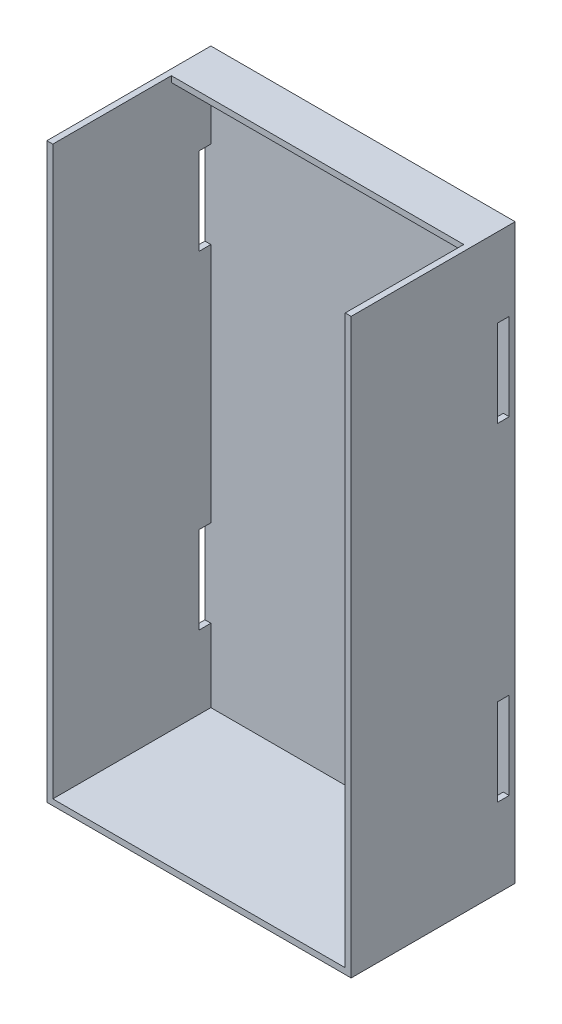
ISO-10303-21;
HEADER;
FILE_DESCRIPTION(('STEP AP214'),'2;1');
FILE_NAME('part.step','',(''),(''),'','','');
FILE_SCHEMA(('AUTOMOTIVE_DESIGN { 1 0 10303 214 1 1 1 1 }'));
ENDSEC;
DATA;
#1=APPLICATION_CONTEXT('core data for automotive mechanical design processes');
#2=APPLICATION_PROTOCOL_DEFINITION('international standard','automotive_design',2000,#1);
#3=PRODUCT_CONTEXT('',#1,'mechanical');
#4=PRODUCT('Part','Part','',(#3));
#5=PRODUCT_RELATED_PRODUCT_CATEGORY('part','',(#4));
#6=PRODUCT_DEFINITION_FORMATION('','',#4);
#7=PRODUCT_DEFINITION_CONTEXT('part definition',#1,'design');
#8=PRODUCT_DEFINITION('design','',#6,#7);
#9=PRODUCT_DEFINITION_SHAPE('','',#8);
#10=(LENGTH_UNIT() NAMED_UNIT(*) SI_UNIT(.MILLI.,.METRE.));
#11=(NAMED_UNIT(*) PLANE_ANGLE_UNIT() SI_UNIT($,.RADIAN.));
#12=(NAMED_UNIT(*) SI_UNIT($,.STERADIAN.) SOLID_ANGLE_UNIT());
#13=UNCERTAINTY_MEASURE_WITH_UNIT(LENGTH_MEASURE(1.E-05),#10,'distance_accuracy_value','');
#14=(GEOMETRIC_REPRESENTATION_CONTEXT(3) GLOBAL_UNCERTAINTY_ASSIGNED_CONTEXT((#13)) GLOBAL_UNIT_ASSIGNED_CONTEXT((#10,
#11,#12)) REPRESENTATION_CONTEXT('',''));
#15=CARTESIAN_POINT('',(0.,0.,0.));
#16=DIRECTION('',(0.,0.,1.));
#17=DIRECTION('',(1.,0.,0.));
#18=AXIS2_PLACEMENT_3D('',#15,#16,#17);
#19=CARTESIAN_POINT('',(0.,0.,1.5));
#20=DIRECTION('',(0.,0.,-1.));
#21=DIRECTION('',(-1.,0.,0.));
#22=AXIS2_PLACEMENT_3D('',#19,#20,#21);
#23=PLANE('',#22);
#24=DIRECTION('',(0.,-1.,0.));
#25=VECTOR('',#24,1.);
#26=CARTESIAN_POINT('',(75.5,1.5,1.5));
#27=LINE('',#26,#25);
#28=CARTESIAN_POINT('',(75.5,20.,1.5));
#29=VERTEX_POINT('',#28);
#30=CARTESIAN_POINT('',(75.5,1.5,1.5));
#31=VERTEX_POINT('',#30);
#32=EDGE_CURVE('E391',#29,#31,#27,.T.);
#33=ORIENTED_EDGE('',*,*,#32,.F.);
#34=DIRECTION('',(1.,0.,0.));
#35=VECTOR('',#34,1.);
#36=CARTESIAN_POINT('',(-23.,20.,1.49999999999999));
#37=LINE('',#36,#35);
#38=CARTESIAN_POINT('',(77.,20.,1.49999999999999));
#39=VERTEX_POINT('',#38);
#40=EDGE_CURVE('E55',#29,#39,#37,.T.);
#41=ORIENTED_EDGE('',*,*,#40,.T.);
#42=DIRECTION('',(0.,1.,0.));
#43=VECTOR('',#42,1.);
#44=CARTESIAN_POINT('',(77.,42.,1.49999999999999));
#45=LINE('',#44,#43);
#46=CARTESIAN_POINT('',(77.,42.,1.49999999999999));
#47=VERTEX_POINT('',#46);
#48=EDGE_CURVE('E262',#39,#47,#45,.T.);
#49=ORIENTED_EDGE('',*,*,#48,.T.);
#50=DIRECTION('',(1.,0.,0.));
#51=VECTOR('',#50,1.);
#52=CARTESIAN_POINT('',(-23.,41.9999999999999,1.49999999999999));
#53=LINE('',#52,#51);
#54=CARTESIAN_POINT('',(75.5,42.,1.49999999999999));
#55=VERTEX_POINT('',#54);
#56=EDGE_CURVE('E276',#55,#47,#53,.T.);
#57=ORIENTED_EDGE('',*,*,#56,.F.);
#58=CARTESIAN_POINT('',(75.5,103.,1.5));
#59=VERTEX_POINT('',#58);
#60=EDGE_CURVE('E220',#59,#55,#27,.T.);
#61=ORIENTED_EDGE('',*,*,#60,.F.);
#62=DIRECTION('',(1.,0.,0.));
#63=VECTOR('',#62,1.);
#64=CARTESIAN_POINT('',(-23.,103.,1.5));
#65=LINE('',#64,#63);
#66=CARTESIAN_POINT('',(77.,103.,1.5));
#67=VERTEX_POINT('',#66);
#68=EDGE_CURVE('E63',#59,#67,#65,.T.);
#69=ORIENTED_EDGE('',*,*,#68,.T.);
#70=DIRECTION('',(0.,1.,0.));
#71=VECTOR('',#70,1.);
#72=CARTESIAN_POINT('',(77.,125.,1.5));
#73=LINE('',#72,#71);
#74=CARTESIAN_POINT('',(77.,125.,1.5));
#75=VERTEX_POINT('',#74);
#76=EDGE_CURVE('E216',#67,#75,#73,.T.);
#77=ORIENTED_EDGE('',*,*,#76,.T.);
#78=DIRECTION('',(1.,0.,0.));
#79=VECTOR('',#78,1.);
#80=CARTESIAN_POINT('',(-23.,125.,1.5));
#81=LINE('',#80,#79);
#82=CARTESIAN_POINT('',(75.5,125.,1.5));
#83=VERTEX_POINT('',#82);
#84=EDGE_CURVE('E251',#83,#75,#81,.T.);
#85=ORIENTED_EDGE('',*,*,#84,.F.);
#86=CARTESIAN_POINT('',(75.5,143.5,1.5));
#87=VERTEX_POINT('',#86);
#88=EDGE_CURVE('E422',#87,#83,#27,.T.);
#89=ORIENTED_EDGE('',*,*,#88,.F.);
#90=DIRECTION('',(1.,0.,0.));
#91=VECTOR('',#90,1.);
#92=CARTESIAN_POINT('',(1.50000000000002,143.5,1.5));
#93=LINE('',#92,#91);
#94=CARTESIAN_POINT('',(1.5,143.5,1.5));
#95=VERTEX_POINT('',#94);
#96=EDGE_CURVE('E364',#95,#87,#93,.T.);
#97=ORIENTED_EDGE('',*,*,#96,.F.);
#98=DIRECTION('',(0.,1.,0.));
#99=VECTOR('',#98,1.);
#100=CARTESIAN_POINT('',(1.5,145.,1.5));
#101=LINE('',#100,#99);
#102=CARTESIAN_POINT('',(1.5,125.,1.5));
#103=VERTEX_POINT('',#102);
#104=EDGE_CURVE('E430',#103,#95,#101,.T.);
#105=ORIENTED_EDGE('',*,*,#104,.F.);
#106=CARTESIAN_POINT('',(0.,125.,1.5));
#107=VERTEX_POINT('',#106);
#108=EDGE_CURVE('E250',#107,#103,#81,.T.);
#109=ORIENTED_EDGE('',*,*,#108,.F.);
#110=DIRECTION('',(0.,1.,0.));
#111=VECTOR('',#110,1.);
#112=CARTESIAN_POINT('',(0.,0.,1.5));
#113=LINE('',#112,#111);
#114=CARTESIAN_POINT('',(0.,103.,1.5));
#115=VERTEX_POINT('',#114);
#116=EDGE_CURVE('E336',#115,#107,#113,.T.);
#117=ORIENTED_EDGE('',*,*,#116,.F.);
#118=CARTESIAN_POINT('',(1.5,103.,1.5));
#119=VERTEX_POINT('',#118);
#120=EDGE_CURVE('E222',#115,#119,#65,.T.);
#121=ORIENTED_EDGE('',*,*,#120,.T.);
#122=CARTESIAN_POINT('',(1.50000000000002,42.,1.49999999999999));
#123=VERTEX_POINT('',#122);
#124=EDGE_CURVE('E434',#123,#119,#101,.T.);
#125=ORIENTED_EDGE('',*,*,#124,.F.);
#126=CARTESIAN_POINT('',(0.,42.,1.49999999999999));
#127=VERTEX_POINT('',#126);
#128=EDGE_CURVE('E275',#127,#123,#53,.T.);
#129=ORIENTED_EDGE('',*,*,#128,.F.);
#130=DIRECTION('',(0.,1.,0.));
#131=VECTOR('',#130,1.);
#132=CARTESIAN_POINT('',(0.,0.,1.5));
#133=LINE('',#132,#131);
#134=CARTESIAN_POINT('',(0.,20.,1.49999999999999));
#135=VERTEX_POINT('',#134);
#136=EDGE_CURVE('E297',#135,#127,#133,.T.);
#137=ORIENTED_EDGE('',*,*,#136,.F.);
#138=CARTESIAN_POINT('',(1.50000000000002,20.,1.49999999999999));
#139=VERTEX_POINT('',#138);
#140=EDGE_CURVE('E279',#135,#139,#37,.T.);
#141=ORIENTED_EDGE('',*,*,#140,.T.);
#142=CARTESIAN_POINT('',(1.50000000000002,1.5,1.5));
#143=VERTEX_POINT('',#142);
#144=EDGE_CURVE('E397',#143,#139,#101,.T.);
#145=ORIENTED_EDGE('',*,*,#144,.F.);
#146=DIRECTION('',(-1.,0.,0.));
#147=VECTOR('',#146,1.);
#148=CARTESIAN_POINT('',(1.50000000000002,1.5,1.5));
#149=LINE('',#148,#147);
#150=EDGE_CURVE('E426',#31,#143,#149,.T.);
#151=ORIENTED_EDGE('',*,*,#150,.F.);
#152=EDGE_LOOP('',(#33,#41,#49,#57,#61,#69,#77,#85,#89,#97,#105,#109,#117,#121,#125,#129,#137,
#141,#145,#151));
#153=FACE_BOUND('',#152,.T.);
#154=ADVANCED_FACE('F39',(#153),#23,.F.);
#155=CARTESIAN_POINT('',(75.5,1.5,41.5));
#156=DIRECTION('',(1.,0.,0.));
#157=DIRECTION('',(0.,0.,-1.));
#158=AXIS2_PLACEMENT_3D('',#155,#156,#157);
#159=PLANE('',#158);
#160=ORIENTED_EDGE('',*,*,#88,.T.);
#161=DIRECTION('',(0.,0.,1.));
#162=VECTOR('',#161,1.);
#163=CARTESIAN_POINT('',(75.5,125.,41.5));
#164=LINE('',#163,#162);
#165=CARTESIAN_POINT('',(75.5,125.,4.5));
#166=VERTEX_POINT('',#165);
#167=EDGE_CURVE('E348',#83,#166,#164,.T.);
#168=ORIENTED_EDGE('',*,*,#167,.T.);
#169=DIRECTION('',(0.,-1.,0.));
#170=VECTOR('',#169,1.);
#171=CARTESIAN_POINT('',(75.5,1.5,4.49999999999999));
#172=LINE('',#171,#170);
#173=CARTESIAN_POINT('',(75.5,103.,4.5));
#174=VERTEX_POINT('',#173);
#175=EDGE_CURVE('E360',#166,#174,#172,.T.);
#176=ORIENTED_EDGE('',*,*,#175,.T.);
#177=DIRECTION('',(0.,0.,-1.));
#178=VECTOR('',#177,1.);
#179=CARTESIAN_POINT('',(75.5,103.,41.5));
#180=LINE('',#179,#178);
#181=EDGE_CURVE('E333',#174,#59,#180,.T.);
#182=ORIENTED_EDGE('',*,*,#181,.T.);
#183=ORIENTED_EDGE('',*,*,#60,.T.);
#184=DIRECTION('',(0.,0.,1.));
#185=VECTOR('',#184,1.);
#186=CARTESIAN_POINT('',(75.5,42.,41.5));
#187=LINE('',#186,#185);
#188=CARTESIAN_POINT('',(75.5,42.,4.5));
#189=VERTEX_POINT('',#188);
#190=EDGE_CURVE('E309',#55,#189,#187,.T.);
#191=ORIENTED_EDGE('',*,*,#190,.T.);
#192=DIRECTION('',(0.,-1.,0.));
#193=VECTOR('',#192,1.);
#194=CARTESIAN_POINT('',(75.5,1.5,4.5));
#195=LINE('',#194,#193);
#196=CARTESIAN_POINT('',(75.5,20.,4.5));
#197=VERTEX_POINT('',#196);
#198=EDGE_CURVE('E321',#189,#197,#195,.T.);
#199=ORIENTED_EDGE('',*,*,#198,.T.);
#200=DIRECTION('',(0.,0.,-1.));
#201=VECTOR('',#200,1.);
#202=CARTESIAN_POINT('',(75.5,20.,41.5));
#203=LINE('',#202,#201);
#204=EDGE_CURVE('E294',#197,#29,#203,.T.);
#205=ORIENTED_EDGE('',*,*,#204,.T.);
#206=ORIENTED_EDGE('',*,*,#32,.T.);
#207=DIRECTION('',(0.,0.,-1.));
#208=VECTOR('',#207,1.);
#209=CARTESIAN_POINT('',(75.5,1.5,41.5));
#210=LINE('',#209,#208);
#211=CARTESIAN_POINT('',(75.5,1.5,41.5));
#212=VERTEX_POINT('',#211);
#213=EDGE_CURVE('E442',#212,#31,#210,.T.);
#214=ORIENTED_EDGE('',*,*,#213,.F.);
#215=DIRECTION('',(0.,-1.,0.));
#216=VECTOR('',#215,1.);
#217=CARTESIAN_POINT('',(75.5,1.5,41.5));
#218=LINE('',#217,#216);
#219=CARTESIAN_POINT('',(75.5,145.,41.5));
#220=VERTEX_POINT('',#219);
#221=EDGE_CURVE('E412',#220,#212,#218,.T.);
#222=ORIENTED_EDGE('',*,*,#221,.F.);
#223=DIRECTION('',(0.,0.,-1.));
#224=VECTOR('',#223,1.);
#225=CARTESIAN_POINT('',(75.5,145.,41.5));
#226=LINE('',#225,#224);
#227=CARTESIAN_POINT('',(75.5,145.,11.5));
#228=VERTEX_POINT('',#227);
#229=EDGE_CURVE('E446',#220,#228,#226,.T.);
#230=ORIENTED_EDGE('',*,*,#229,.T.);
#231=DIRECTION('',(0.,1.,0.));
#232=VECTOR('',#231,1.);
#233=CARTESIAN_POINT('',(75.5,145.,11.5));
#234=LINE('',#233,#232);
#235=CARTESIAN_POINT('',(75.5,143.5,11.5));
#236=VERTEX_POINT('',#235);
#237=EDGE_CURVE('E373',#236,#228,#234,.T.);
#238=ORIENTED_EDGE('',*,*,#237,.F.);
#239=DIRECTION('',(0.,0.,-1.));
#240=VECTOR('',#239,1.);
#241=CARTESIAN_POINT('',(75.5,143.5,11.5));
#242=LINE('',#241,#240);
#243=EDGE_CURVE('E381',#236,#87,#242,.T.);
#244=ORIENTED_EDGE('',*,*,#243,.T.);
#245=EDGE_LOOP('',(#160,#168,#176,#182,#183,#191,#199,#205,#206,#214,#222,#230,#238,#244));
#246=FACE_BOUND('',#245,.T.);
#247=ADVANCED_FACE('F498',(#246),#159,.F.);
#248=CARTESIAN_POINT('',(1.5,145.,41.5));
#249=DIRECTION('',(-1.,0.,0.));
#250=DIRECTION('',(0.,-1.,0.));
#251=AXIS2_PLACEMENT_3D('',#248,#249,#250);
#252=PLANE('',#251);
#253=DIRECTION('',(0.,1.,0.));
#254=VECTOR('',#253,1.);
#255=CARTESIAN_POINT('',(1.5,145.,4.5));
#256=LINE('',#255,#254);
#257=CARTESIAN_POINT('',(1.50000000000001,103.,4.5));
#258=VERTEX_POINT('',#257);
#259=CARTESIAN_POINT('',(1.5,125.,4.5));
#260=VERTEX_POINT('',#259);
#261=EDGE_CURVE('E356',#258,#260,#256,.T.);
#262=ORIENTED_EDGE('',*,*,#261,.T.);
#263=DIRECTION('',(0.,0.,-1.));
#264=VECTOR('',#263,1.);
#265=CARTESIAN_POINT('',(1.5,125.,41.5));
#266=LINE('',#265,#264);
#267=EDGE_CURVE('E344',#260,#103,#266,.T.);
#268=ORIENTED_EDGE('',*,*,#267,.T.);
#269=ORIENTED_EDGE('',*,*,#104,.T.);
#270=DIRECTION('',(0.,0.,-1.));
#271=VECTOR('',#270,1.);
#272=CARTESIAN_POINT('',(1.50000000000002,143.5,11.5));
#273=LINE('',#272,#271);
#274=CARTESIAN_POINT('',(1.50000000000002,143.5,11.5));
#275=VERTEX_POINT('',#274);
#276=EDGE_CURVE('E387',#275,#95,#273,.T.);
#277=ORIENTED_EDGE('',*,*,#276,.F.);
#278=DIRECTION('',(0.,-1.,0.));
#279=VECTOR('',#278,1.);
#280=CARTESIAN_POINT('',(1.50000000000002,143.5,11.5));
#281=LINE('',#280,#279);
#282=CARTESIAN_POINT('',(1.5,145.,11.5));
#283=VERTEX_POINT('',#282);
#284=EDGE_CURVE('E365',#283,#275,#281,.T.);
#285=ORIENTED_EDGE('',*,*,#284,.F.);
#286=DIRECTION('',(0.,0.,-1.));
#287=VECTOR('',#286,1.);
#288=CARTESIAN_POINT('',(1.5,145.,41.5));
#289=LINE('',#288,#287);
#290=CARTESIAN_POINT('',(1.5,145.,41.5));
#291=VERTEX_POINT('',#290);
#292=EDGE_CURVE('E421',#291,#283,#289,.T.);
#293=ORIENTED_EDGE('',*,*,#292,.F.);
#294=DIRECTION('',(0.,1.,0.));
#295=VECTOR('',#294,1.);
#296=CARTESIAN_POINT('',(1.5,145.,41.5));
#297=LINE('',#296,#295);
#298=CARTESIAN_POINT('',(1.50000000000002,1.5,41.5));
#299=VERTEX_POINT('',#298);
#300=EDGE_CURVE('E418',#299,#291,#297,.T.);
#301=ORIENTED_EDGE('',*,*,#300,.F.);
#302=DIRECTION('',(0.,0.,-1.));
#303=VECTOR('',#302,1.);
#304=CARTESIAN_POINT('',(1.50000000000002,1.5,41.5));
#305=LINE('',#304,#303);
#306=EDGE_CURVE('E438',#299,#143,#305,.T.);
#307=ORIENTED_EDGE('',*,*,#306,.T.);
#308=ORIENTED_EDGE('',*,*,#144,.T.);
#309=DIRECTION('',(0.,0.,1.));
#310=VECTOR('',#309,1.);
#311=CARTESIAN_POINT('',(1.50000000000002,20.,41.5));
#312=LINE('',#311,#310);
#313=CARTESIAN_POINT('',(1.50000000000002,20.,4.5));
#314=VERTEX_POINT('',#313);
#315=EDGE_CURVE('E290',#139,#314,#312,.T.);
#316=ORIENTED_EDGE('',*,*,#315,.T.);
#317=DIRECTION('',(0.,1.,0.));
#318=VECTOR('',#317,1.);
#319=CARTESIAN_POINT('',(1.5,145.,4.50000000000002));
#320=LINE('',#319,#318);
#321=CARTESIAN_POINT('',(1.50000000000001,42.,4.5));
#322=VERTEX_POINT('',#321);
#323=EDGE_CURVE('E317',#314,#322,#320,.T.);
#324=ORIENTED_EDGE('',*,*,#323,.T.);
#325=DIRECTION('',(0.,0.,-1.));
#326=VECTOR('',#325,1.);
#327=CARTESIAN_POINT('',(1.50000000000001,42.,41.5));
#328=LINE('',#327,#326);
#329=EDGE_CURVE('E305',#322,#123,#328,.T.);
#330=ORIENTED_EDGE('',*,*,#329,.T.);
#331=ORIENTED_EDGE('',*,*,#124,.T.);
#332=DIRECTION('',(0.,0.,1.));
#333=VECTOR('',#332,1.);
#334=CARTESIAN_POINT('',(1.50000000000001,103.,41.5));
#335=LINE('',#334,#333);
#336=EDGE_CURVE('E329',#119,#258,#335,.T.);
#337=ORIENTED_EDGE('',*,*,#336,.T.);
#338=EDGE_LOOP('',(#262,#268,#269,#277,#285,#293,#301,#307,#308,#316,#324,#330,#331,#337));
#339=FACE_BOUND('',#338,.T.);
#340=ADVANCED_FACE('F509',(#339),#252,.F.);
#341=CARTESIAN_POINT('',(0.,0.,1.5));
#342=DIRECTION('',(1.,0.,0.));
#343=DIRECTION('',(0.,0.,-1.));
#344=AXIS2_PLACEMENT_3D('',#341,#342,#343);
#345=PLANE('',#344);
#346=DIRECTION('',(0.,0.,1.));
#347=VECTOR('',#346,1.);
#348=CARTESIAN_POINT('',(0.,125.,1.5));
#349=LINE('',#348,#347);
#350=CARTESIAN_POINT('',(0.,125.,4.5));
#351=VERTEX_POINT('',#350);
#352=EDGE_CURVE('E340',#107,#351,#349,.T.);
#353=ORIENTED_EDGE('',*,*,#352,.T.);
#354=DIRECTION('',(0.,-1.,0.));
#355=VECTOR('',#354,1.);
#356=CARTESIAN_POINT('',(0.,0.,4.49999999999999));
#357=LINE('',#356,#355);
#358=CARTESIAN_POINT('',(0.,103.,4.5));
#359=VERTEX_POINT('',#358);
#360=EDGE_CURVE('E352',#351,#359,#357,.T.);
#361=ORIENTED_EDGE('',*,*,#360,.T.);
#362=DIRECTION('',(0.,0.,-1.));
#363=VECTOR('',#362,1.);
#364=CARTESIAN_POINT('',(0.,103.,1.5));
#365=LINE('',#364,#363);
#366=EDGE_CURVE('E325',#359,#115,#365,.T.);
#367=ORIENTED_EDGE('',*,*,#366,.T.);
#368=ORIENTED_EDGE('',*,*,#116,.T.);
#369=EDGE_LOOP('',(#353,#361,#367,#368));
#370=FACE_BOUND('',#369,.T.);
#371=DIRECTION('',(0.,0.,1.));
#372=VECTOR('',#371,1.);
#373=CARTESIAN_POINT('',(0.,42.,1.5));
#374=LINE('',#373,#372);
#375=CARTESIAN_POINT('',(0.,42.,4.5));
#376=VERTEX_POINT('',#375);
#377=EDGE_CURVE('E301',#127,#376,#374,.T.);
#378=ORIENTED_EDGE('',*,*,#377,.T.);
#379=DIRECTION('',(0.,-1.,0.));
#380=VECTOR('',#379,1.);
#381=CARTESIAN_POINT('',(0.,0.,4.5));
#382=LINE('',#381,#380);
#383=CARTESIAN_POINT('',(0.,20.,4.5));
#384=VERTEX_POINT('',#383);
#385=EDGE_CURVE('E313',#376,#384,#382,.T.);
#386=ORIENTED_EDGE('',*,*,#385,.T.);
#387=DIRECTION('',(0.,0.,-1.));
#388=VECTOR('',#387,1.);
#389=CARTESIAN_POINT('',(0.,20.,1.5));
#390=LINE('',#389,#388);
#391=EDGE_CURVE('E286',#384,#135,#390,.T.);
#392=ORIENTED_EDGE('',*,*,#391,.T.);
#393=ORIENTED_EDGE('',*,*,#136,.T.);
#394=EDGE_LOOP('',(#378,#386,#392,#393));
#395=FACE_BOUND('',#394,.T.);
#396=DIRECTION('',(0.,-1.,0.));
#397=VECTOR('',#396,1.);
#398=CARTESIAN_POINT('',(0.,0.,0.));
#399=LINE('',#398,#397);
#400=CARTESIAN_POINT('',(0.,145.,0.));
#401=VERTEX_POINT('',#400);
#402=CARTESIAN_POINT('',(0.,0.,0.));
#403=VERTEX_POINT('',#402);
#404=EDGE_CURVE('E449',#401,#403,#399,.T.);
#405=ORIENTED_EDGE('',*,*,#404,.T.);
#406=DIRECTION('',(0.,0.,-1.));
#407=VECTOR('',#406,1.);
#408=CARTESIAN_POINT('',(0.,0.,1.5));
#409=LINE('',#408,#407);
#410=CARTESIAN_POINT('',(0.,0.,41.5));
#411=VERTEX_POINT('',#410);
#412=EDGE_CURVE('E11',#411,#403,#409,.T.);
#413=ORIENTED_EDGE('',*,*,#412,.F.);
#414=DIRECTION('',(0.,-1.,0.));
#415=VECTOR('',#414,1.);
#416=CARTESIAN_POINT('',(0.,145.,41.5));
#417=LINE('',#416,#415);
#418=CARTESIAN_POINT('',(0.,145.,41.5));
#419=VERTEX_POINT('',#418);
#420=EDGE_CURVE('E396',#419,#411,#417,.T.);
#421=ORIENTED_EDGE('',*,*,#420,.F.);
#422=DIRECTION('',(0.,0.,-1.));
#423=VECTOR('',#422,1.);
#424=CARTESIAN_POINT('',(0.,145.,1.5));
#425=LINE('',#424,#423);
#426=EDGE_CURVE('E462',#419,#401,#425,.T.);
#427=ORIENTED_EDGE('',*,*,#426,.T.);
#428=EDGE_LOOP('',(#405,#413,#421,#427));
#429=FACE_BOUND('',#428,.T.);
#430=ADVANCED_FACE('F41',(#370,#395,#429),#345,.F.);
#431=CARTESIAN_POINT('',(0.,0.,1.5));
#432=DIRECTION('',(0.,1.,0.));
#433=DIRECTION('',(0.,0.,1.));
#434=AXIS2_PLACEMENT_3D('',#431,#432,#433);
#435=PLANE('',#434);
#436=DIRECTION('',(1.,0.,0.));
#437=VECTOR('',#436,1.);
#438=CARTESIAN_POINT('',(0.,0.,0.));
#439=LINE('',#438,#437);
#440=CARTESIAN_POINT('',(77.,0.,0.));
#441=VERTEX_POINT('',#440);
#442=EDGE_CURVE('E453',#403,#441,#439,.T.);
#443=ORIENTED_EDGE('',*,*,#442,.T.);
#444=DIRECTION('',(0.,0.,-1.));
#445=VECTOR('',#444,1.);
#446=CARTESIAN_POINT('',(77.,0.,1.5));
#447=LINE('',#446,#445);
#448=CARTESIAN_POINT('',(77.,0.,41.5));
#449=VERTEX_POINT('',#448);
#450=EDGE_CURVE('E48',#449,#441,#447,.T.);
#451=ORIENTED_EDGE('',*,*,#450,.F.);
#452=DIRECTION('',(1.,0.,0.));
#453=VECTOR('',#452,1.);
#454=CARTESIAN_POINT('',(0.,0.,41.5));
#455=LINE('',#454,#453);
#456=EDGE_CURVE('E401',#411,#449,#455,.T.);
#457=ORIENTED_EDGE('',*,*,#456,.F.);
#458=ORIENTED_EDGE('',*,*,#412,.T.);
#459=EDGE_LOOP('',(#443,#451,#457,#458));
#460=FACE_BOUND('',#459,.T.);
#461=ADVANCED_FACE('F502',(#460),#435,.F.);
#462=CARTESIAN_POINT('',(77.,0.,1.5));
#463=DIRECTION('',(-1.,0.,0.));
#464=DIRECTION('',(0.,-1.,0.));
#465=AXIS2_PLACEMENT_3D('',#462,#463,#464);
#466=PLANE('',#465);
#467=DIRECTION('',(0.,0.,-1.));
#468=VECTOR('',#467,1.);
#469=CARTESIAN_POINT('',(77.,103.,4.5));
#470=LINE('',#469,#468);
#471=CARTESIAN_POINT('',(77.,103.,4.5));
#472=VERTEX_POINT('',#471);
#473=EDGE_CURVE('E227',#472,#67,#470,.T.);
#474=ORIENTED_EDGE('',*,*,#473,.F.);
#475=DIRECTION('',(0.,-1.,0.));
#476=VECTOR('',#475,1.);
#477=CARTESIAN_POINT('',(77.,125.,4.5));
#478=LINE('',#477,#476);
#479=CARTESIAN_POINT('',(77.,125.,4.5));
#480=VERTEX_POINT('',#479);
#481=EDGE_CURVE('E234',#480,#472,#478,.T.);
#482=ORIENTED_EDGE('',*,*,#481,.F.);
#483=DIRECTION('',(0.,0.,1.));
#484=VECTOR('',#483,1.);
#485=CARTESIAN_POINT('',(77.,125.,4.5));
#486=LINE('',#485,#484);
#487=EDGE_CURVE('E239',#75,#480,#486,.T.);
#488=ORIENTED_EDGE('',*,*,#487,.F.);
#489=ORIENTED_EDGE('',*,*,#76,.F.);
#490=EDGE_LOOP('',(#474,#482,#488,#489));
#491=FACE_BOUND('',#490,.T.);
#492=DIRECTION('',(0.,0.,-1.));
#493=VECTOR('',#492,1.);
#494=CARTESIAN_POINT('',(77.,20.,4.5));
#495=LINE('',#494,#493);
#496=CARTESIAN_POINT('',(77.,20.,4.5));
#497=VERTEX_POINT('',#496);
#498=EDGE_CURVE('E259',#497,#39,#495,.T.);
#499=ORIENTED_EDGE('',*,*,#498,.F.);
#500=DIRECTION('',(0.,-1.,0.));
#501=VECTOR('',#500,1.);
#502=CARTESIAN_POINT('',(77.,42.,4.5));
#503=LINE('',#502,#501);
#504=CARTESIAN_POINT('',(77.,42.,4.5));
#505=VERTEX_POINT('',#504);
#506=EDGE_CURVE('E256',#505,#497,#503,.T.);
#507=ORIENTED_EDGE('',*,*,#506,.F.);
#508=DIRECTION('',(0.,0.,1.));
#509=VECTOR('',#508,1.);
#510=CARTESIAN_POINT('',(77.,42.,4.5));
#511=LINE('',#510,#509);
#512=EDGE_CURVE('E266',#47,#505,#511,.T.);
#513=ORIENTED_EDGE('',*,*,#512,.F.);
#514=ORIENTED_EDGE('',*,*,#48,.F.);
#515=EDGE_LOOP('',(#499,#507,#513,#514));
#516=FACE_BOUND('',#515,.T.);
#517=DIRECTION('',(0.,1.,0.));
#518=VECTOR('',#517,1.);
#519=CARTESIAN_POINT('',(77.,0.,0.));
#520=LINE('',#519,#518);
#521=CARTESIAN_POINT('',(77.,145.,0.));
#522=VERTEX_POINT('',#521);
#523=EDGE_CURVE('E456',#441,#522,#520,.T.);
#524=ORIENTED_EDGE('',*,*,#523,.T.);
#525=DIRECTION('',(0.,0.,-1.));
#526=VECTOR('',#525,1.);
#527=CARTESIAN_POINT('',(77.,145.,1.5));
#528=LINE('',#527,#526);
#529=CARTESIAN_POINT('',(77.,145.,41.5));
#530=VERTEX_POINT('',#529);
#531=EDGE_CURVE('E466',#530,#522,#528,.T.);
#532=ORIENTED_EDGE('',*,*,#531,.F.);
#533=DIRECTION('',(0.,1.,0.));
#534=VECTOR('',#533,1.);
#535=CARTESIAN_POINT('',(77.,0.,41.5));
#536=LINE('',#535,#534);
#537=EDGE_CURVE('E405',#449,#530,#536,.T.);
#538=ORIENTED_EDGE('',*,*,#537,.F.);
#539=ORIENTED_EDGE('',*,*,#450,.T.);
#540=EDGE_LOOP('',(#524,#532,#538,#539));
#541=FACE_BOUND('',#540,.T.);
#542=ADVANCED_FACE('F236',(#491,#516,#541),#466,.F.);
#543=CARTESIAN_POINT('',(0.,145.,1.5));
#544=DIRECTION('',(0.,-1.,0.));
#545=DIRECTION('',(0.,0.,-1.));
#546=AXIS2_PLACEMENT_3D('',#543,#544,#545);
#547=PLANE('',#546);
#548=DIRECTION('',(-1.,0.,0.));
#549=VECTOR('',#548,1.);
#550=CARTESIAN_POINT('',(0.,145.,0.));
#551=LINE('',#550,#549);
#552=EDGE_CURVE('E459',#522,#401,#551,.T.);
#553=ORIENTED_EDGE('',*,*,#552,.T.);
#554=ORIENTED_EDGE('',*,*,#426,.F.);
#555=DIRECTION('',(-1.,0.,0.));
#556=VECTOR('',#555,1.);
#557=CARTESIAN_POINT('',(1.5,145.,41.5));
#558=LINE('',#557,#556);
#559=EDGE_CURVE('E392',#291,#419,#558,.T.);
#560=ORIENTED_EDGE('',*,*,#559,.F.);
#561=ORIENTED_EDGE('',*,*,#292,.T.);
#562=DIRECTION('',(-1.,0.,0.));
#563=VECTOR('',#562,1.);
#564=CARTESIAN_POINT('',(1.50000000000001,145.,11.5));
#565=LINE('',#564,#563);
#566=EDGE_CURVE('E377',#228,#283,#565,.T.);
#567=ORIENTED_EDGE('',*,*,#566,.F.);
#568=ORIENTED_EDGE('',*,*,#229,.F.);
#569=DIRECTION('',(-1.,0.,0.));
#570=VECTOR('',#569,1.);
#571=CARTESIAN_POINT('',(77.,145.,41.5));
#572=LINE('',#571,#570);
#573=EDGE_CURVE('E409',#530,#220,#572,.T.);
#574=ORIENTED_EDGE('',*,*,#573,.F.);
#575=ORIENTED_EDGE('',*,*,#531,.T.);
#576=EDGE_LOOP('',(#553,#554,#560,#561,#567,#568,#574,#575));
#577=FACE_BOUND('',#576,.T.);
#578=ADVANCED_FACE('F481',(#577),#547,.F.);
#579=CARTESIAN_POINT('',(0.,0.,0.));
#580=DIRECTION('',(0.,0.,-1.));
#581=DIRECTION('',(-1.,0.,0.));
#582=AXIS2_PLACEMENT_3D('',#579,#580,#581);
#583=PLANE('',#582);
#584=ORIENTED_EDGE('',*,*,#404,.F.);
#585=ORIENTED_EDGE('',*,*,#552,.F.);
#586=ORIENTED_EDGE('',*,*,#523,.F.);
#587=ORIENTED_EDGE('',*,*,#442,.F.);
#588=EDGE_LOOP('',(#584,#585,#586,#587));
#589=FACE_BOUND('',#588,.T.);
#590=ADVANCED_FACE('F479',(#589),#583,.T.);
#591=CARTESIAN_POINT('',(1.50000000000002,1.5,41.5));
#592=DIRECTION('',(0.,-1.,0.));
#593=DIRECTION('',(0.,0.,-1.));
#594=AXIS2_PLACEMENT_3D('',#591,#592,#593);
#595=PLANE('',#594);
#596=ORIENTED_EDGE('',*,*,#150,.T.);
#597=ORIENTED_EDGE('',*,*,#306,.F.);
#598=DIRECTION('',(-1.,0.,0.));
#599=VECTOR('',#598,1.);
#600=CARTESIAN_POINT('',(1.50000000000002,1.5,41.5));
#601=LINE('',#600,#599);
#602=EDGE_CURVE('E415',#212,#299,#601,.T.);
#603=ORIENTED_EDGE('',*,*,#602,.F.);
#604=ORIENTED_EDGE('',*,*,#213,.T.);
#605=EDGE_LOOP('',(#596,#597,#603,#604));
#606=FACE_BOUND('',#605,.T.);
#607=ADVANCED_FACE('F521',(#606),#595,.F.);
#608=CARTESIAN_POINT('',(0.,0.,41.5));
#609=DIRECTION('',(0.,0.,1.));
#610=DIRECTION('',(1.,0.,0.));
#611=AXIS2_PLACEMENT_3D('',#608,#609,#610);
#612=PLANE('',#611);
#613=ORIENTED_EDGE('',*,*,#559,.T.);
#614=ORIENTED_EDGE('',*,*,#420,.T.);
#615=ORIENTED_EDGE('',*,*,#456,.T.);
#616=ORIENTED_EDGE('',*,*,#537,.T.);
#617=ORIENTED_EDGE('',*,*,#573,.T.);
#618=ORIENTED_EDGE('',*,*,#221,.T.);
#619=ORIENTED_EDGE('',*,*,#602,.T.);
#620=ORIENTED_EDGE('',*,*,#300,.T.);
#621=EDGE_LOOP('',(#613,#614,#615,#616,#617,#618,#619,#620));
#622=FACE_BOUND('',#621,.T.);
#623=ADVANCED_FACE('F487',(#622),#612,.T.);
#624=CARTESIAN_POINT('',(1.50000000000002,143.5,11.5));
#625=DIRECTION('',(0.,1.,0.));
#626=DIRECTION('',(0.,0.,1.));
#627=AXIS2_PLACEMENT_3D('',#624,#625,#626);
#628=PLANE('',#627);
#629=ORIENTED_EDGE('',*,*,#96,.T.);
#630=ORIENTED_EDGE('',*,*,#243,.F.);
#631=DIRECTION('',(1.,0.,0.));
#632=VECTOR('',#631,1.);
#633=CARTESIAN_POINT('',(1.50000000000002,143.5,11.5));
#634=LINE('',#633,#632);
#635=EDGE_CURVE('E369',#275,#236,#634,.T.);
#636=ORIENTED_EDGE('',*,*,#635,.F.);
#637=ORIENTED_EDGE('',*,*,#276,.T.);
#638=EDGE_LOOP('',(#629,#630,#636,#637));
#639=FACE_BOUND('',#638,.T.);
#640=ADVANCED_FACE('F544',(#639),#628,.F.);
#641=CARTESIAN_POINT('',(0.,0.,11.5));
#642=DIRECTION('',(0.,0.,-1.));
#643=DIRECTION('',(-1.,0.,0.));
#644=AXIS2_PLACEMENT_3D('',#641,#642,#643);
#645=PLANE('',#644);
#646=ORIENTED_EDGE('',*,*,#284,.T.);
#647=ORIENTED_EDGE('',*,*,#635,.T.);
#648=ORIENTED_EDGE('',*,*,#237,.T.);
#649=ORIENTED_EDGE('',*,*,#566,.T.);
#650=EDGE_LOOP('',(#646,#647,#648,#649));
#651=FACE_BOUND('',#650,.T.);
#652=ADVANCED_FACE('F494',(#651),#645,.F.);
#653=CARTESIAN_POINT('',(-23.,20.,4.5));
#654=DIRECTION('',(0.,-1.,0.));
#655=DIRECTION('',(1.,0.,0.));
#656=AXIS2_PLACEMENT_3D('',#653,#654,#655);
#657=PLANE('',#656);
#658=DIRECTION('',(1.,0.,0.));
#659=VECTOR('',#658,1.);
#660=CARTESIAN_POINT('',(-23.,20.,4.5));
#661=LINE('',#660,#659);
#662=EDGE_CURVE('E270',#197,#497,#661,.T.);
#663=ORIENTED_EDGE('',*,*,#662,.T.);
#664=ORIENTED_EDGE('',*,*,#498,.T.);
#665=ORIENTED_EDGE('',*,*,#40,.F.);
#666=ORIENTED_EDGE('',*,*,#204,.F.);
#667=EDGE_LOOP('',(#663,#664,#665,#666));
#668=FACE_BOUND('',#667,.T.);
#669=ADVANCED_FACE('F557',(#668),#657,.F.);
#670=CARTESIAN_POINT('',(-23.,41.9999999999999,4.5));
#671=DIRECTION('',(0.,1.,0.));
#672=DIRECTION('',(-1.,0.,0.));
#673=AXIS2_PLACEMENT_3D('',#670,#671,#672);
#674=PLANE('',#673);
#675=ORIENTED_EDGE('',*,*,#56,.T.);
#676=ORIENTED_EDGE('',*,*,#512,.T.);
#677=DIRECTION('',(1.,0.,0.));
#678=VECTOR('',#677,1.);
#679=CARTESIAN_POINT('',(-23.,41.9999999999999,4.5));
#680=LINE('',#679,#678);
#681=EDGE_CURVE('E271',#189,#505,#680,.T.);
#682=ORIENTED_EDGE('',*,*,#681,.F.);
#683=ORIENTED_EDGE('',*,*,#190,.F.);
#684=EDGE_LOOP('',(#675,#676,#682,#683));
#685=FACE_BOUND('',#684,.T.);
#686=ADVANCED_FACE('F564',(#685),#674,.F.);
#687=CARTESIAN_POINT('',(-23.,41.9999999999999,4.5));
#688=DIRECTION('',(0.,0.,1.));
#689=DIRECTION('',(0.,-1.,0.));
#690=AXIS2_PLACEMENT_3D('',#687,#688,#689);
#691=PLANE('',#690);
#692=ORIENTED_EDGE('',*,*,#681,.T.);
#693=ORIENTED_EDGE('',*,*,#506,.T.);
#694=ORIENTED_EDGE('',*,*,#662,.F.);
#695=ORIENTED_EDGE('',*,*,#198,.F.);
#696=EDGE_LOOP('',(#692,#693,#694,#695));
#697=FACE_BOUND('',#696,.T.);
#698=ADVANCED_FACE('F572',(#697),#691,.F.);
#699=CARTESIAN_POINT('',(-23.,103.,4.5));
#700=DIRECTION('',(0.,-1.,0.));
#701=DIRECTION('',(1.,0.,0.));
#702=AXIS2_PLACEMENT_3D('',#699,#700,#701);
#703=PLANE('',#702);
#704=DIRECTION('',(1.,0.,0.));
#705=VECTOR('',#704,1.);
#706=CARTESIAN_POINT('',(-23.,103.,4.5));
#707=LINE('',#706,#705);
#708=EDGE_CURVE('E230',#174,#472,#707,.T.);
#709=ORIENTED_EDGE('',*,*,#708,.T.);
#710=ORIENTED_EDGE('',*,*,#473,.T.);
#711=ORIENTED_EDGE('',*,*,#68,.F.);
#712=ORIENTED_EDGE('',*,*,#181,.F.);
#713=EDGE_LOOP('',(#709,#710,#711,#712));
#714=FACE_BOUND('',#713,.T.);
#715=ADVANCED_FACE('F228',(#714),#703,.F.);
#716=CARTESIAN_POINT('',(-23.,125.,4.5));
#717=DIRECTION('',(0.,1.,0.));
#718=DIRECTION('',(-1.,0.,0.));
#719=AXIS2_PLACEMENT_3D('',#716,#717,#718);
#720=PLANE('',#719);
#721=ORIENTED_EDGE('',*,*,#84,.T.);
#722=ORIENTED_EDGE('',*,*,#487,.T.);
#723=DIRECTION('',(1.,0.,0.));
#724=VECTOR('',#723,1.);
#725=CARTESIAN_POINT('',(-23.,125.,4.5));
#726=LINE('',#725,#724);
#727=EDGE_CURVE('E246',#166,#480,#726,.T.);
#728=ORIENTED_EDGE('',*,*,#727,.F.);
#729=ORIENTED_EDGE('',*,*,#167,.F.);
#730=EDGE_LOOP('',(#721,#722,#728,#729));
#731=FACE_BOUND('',#730,.T.);
#732=ADVANCED_FACE('F589',(#731),#720,.F.);
#733=CARTESIAN_POINT('',(-23.,125.,4.5));
#734=DIRECTION('',(0.,0.,1.));
#735=DIRECTION('',(0.,-1.,0.));
#736=AXIS2_PLACEMENT_3D('',#733,#734,#735);
#737=PLANE('',#736);
#738=ORIENTED_EDGE('',*,*,#727,.T.);
#739=ORIENTED_EDGE('',*,*,#481,.T.);
#740=ORIENTED_EDGE('',*,*,#708,.F.);
#741=ORIENTED_EDGE('',*,*,#175,.F.);
#742=EDGE_LOOP('',(#738,#739,#740,#741));
#743=FACE_BOUND('',#742,.T.);
#744=ADVANCED_FACE('F597',(#743),#737,.F.);
#745=EDGE_CURVE('E282',#384,#314,#661,.T.);
#746=ORIENTED_EDGE('',*,*,#745,.F.);
#747=ORIENTED_EDGE('',*,*,#385,.F.);
#748=EDGE_CURVE('E274',#376,#322,#680,.T.);
#749=ORIENTED_EDGE('',*,*,#748,.T.);
#750=ORIENTED_EDGE('',*,*,#323,.F.);
#751=EDGE_LOOP('',(#746,#747,#749,#750));
#752=FACE_BOUND('',#751,.T.);
#753=ADVANCED_FACE('F583',(#752),#691,.F.);
#754=ORIENTED_EDGE('',*,*,#748,.F.);
#755=ORIENTED_EDGE('',*,*,#377,.F.);
#756=ORIENTED_EDGE('',*,*,#128,.T.);
#757=ORIENTED_EDGE('',*,*,#329,.F.);
#758=EDGE_LOOP('',(#754,#755,#756,#757));
#759=FACE_BOUND('',#758,.T.);
#760=ADVANCED_FACE('F575',(#759),#674,.F.);
#761=ORIENTED_EDGE('',*,*,#140,.F.);
#762=ORIENTED_EDGE('',*,*,#391,.F.);
#763=ORIENTED_EDGE('',*,*,#745,.T.);
#764=ORIENTED_EDGE('',*,*,#315,.F.);
#765=EDGE_LOOP('',(#761,#762,#763,#764));
#766=FACE_BOUND('',#765,.T.);
#767=ADVANCED_FACE('F566',(#766),#657,.F.);
#768=EDGE_CURVE('E223',#359,#258,#707,.T.);
#769=ORIENTED_EDGE('',*,*,#768,.F.);
#770=ORIENTED_EDGE('',*,*,#360,.F.);
#771=EDGE_CURVE('E249',#351,#260,#726,.T.);
#772=ORIENTED_EDGE('',*,*,#771,.T.);
#773=ORIENTED_EDGE('',*,*,#261,.F.);
#774=EDGE_LOOP('',(#769,#770,#772,#773));
#775=FACE_BOUND('',#774,.T.);
#776=ADVANCED_FACE('F608',(#775),#737,.F.);
#777=ORIENTED_EDGE('',*,*,#771,.F.);
#778=ORIENTED_EDGE('',*,*,#352,.F.);
#779=ORIENTED_EDGE('',*,*,#108,.T.);
#780=ORIENTED_EDGE('',*,*,#267,.F.);
#781=EDGE_LOOP('',(#777,#778,#779,#780));
#782=FACE_BOUND('',#781,.T.);
#783=ADVANCED_FACE('F600',(#782),#720,.F.);
#784=ORIENTED_EDGE('',*,*,#120,.F.);
#785=ORIENTED_EDGE('',*,*,#366,.F.);
#786=ORIENTED_EDGE('',*,*,#768,.T.);
#787=ORIENTED_EDGE('',*,*,#336,.F.);
#788=EDGE_LOOP('',(#784,#785,#786,#787));
#789=FACE_BOUND('',#788,.T.);
#790=ADVANCED_FACE('F591',(#789),#703,.F.);
#791=CLOSED_SHELL('',(#154,#247,#340,#430,#461,#542,#578,#590,#607,#623,#640,#652,#669,#686,
#698,#715,#732,#744,#753,#760,#767,#776,#783,#790));
#792=MANIFOLD_SOLID_BREP('B2',#791);
#793=ADVANCED_BREP_SHAPE_REPRESENTATION('',(#18,#792),#14);
#794=SHAPE_DEFINITION_REPRESENTATION(#9,#793);
ENDSEC;
END-ISO-10303-21;
